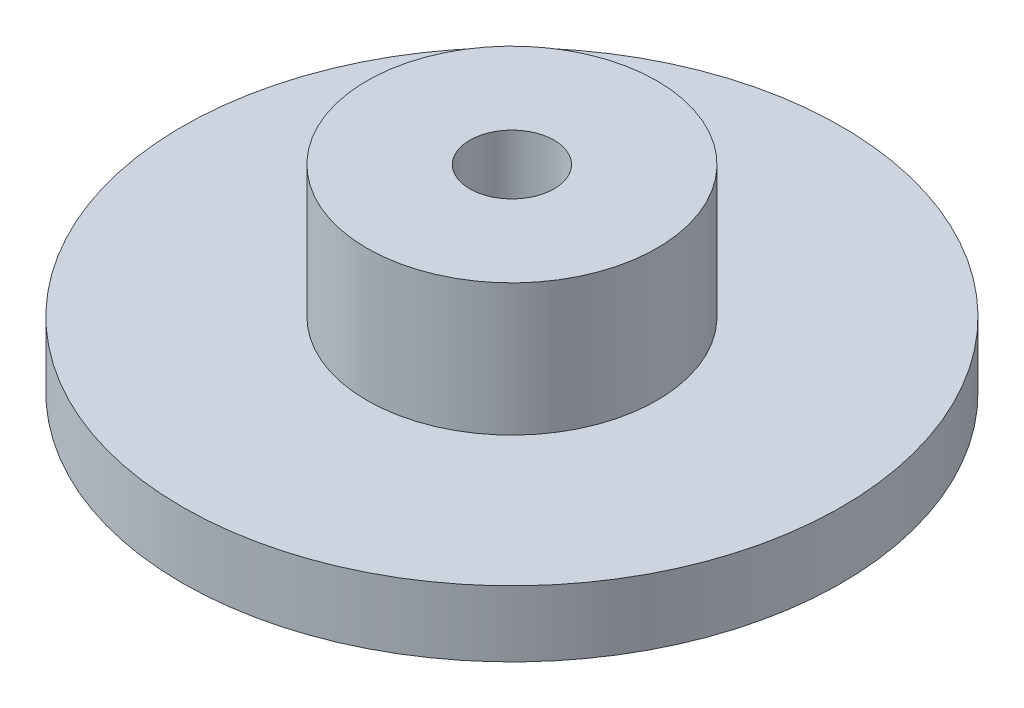
ISO-10303-21;
HEADER;
FILE_DESCRIPTION(('STEP AP214'),'2;1');
FILE_NAME('part.step','',(''),(''),'','','');
FILE_SCHEMA(('AUTOMOTIVE_DESIGN { 1 0 10303 214 1 1 1 1 }'));
ENDSEC;
DATA;
#1=APPLICATION_CONTEXT('core data for automotive mechanical design processes');
#2=APPLICATION_PROTOCOL_DEFINITION('international standard','automotive_design',2000,#1);
#3=PRODUCT_CONTEXT('',#1,'mechanical');
#4=PRODUCT('Part','Part','',(#3));
#5=PRODUCT_RELATED_PRODUCT_CATEGORY('part','',(#4));
#6=PRODUCT_DEFINITION_FORMATION('','',#4);
#7=PRODUCT_DEFINITION_CONTEXT('part definition',#1,'design');
#8=PRODUCT_DEFINITION('design','',#6,#7);
#9=PRODUCT_DEFINITION_SHAPE('','',#8);
#10=(LENGTH_UNIT() NAMED_UNIT(*) SI_UNIT(.MILLI.,.METRE.));
#11=(NAMED_UNIT(*) PLANE_ANGLE_UNIT() SI_UNIT($,.RADIAN.));
#12=(NAMED_UNIT(*) SI_UNIT($,.STERADIAN.) SOLID_ANGLE_UNIT());
#13=UNCERTAINTY_MEASURE_WITH_UNIT(LENGTH_MEASURE(1.E-05),#10,'distance_accuracy_value','');
#14=(GEOMETRIC_REPRESENTATION_CONTEXT(3) GLOBAL_UNCERTAINTY_ASSIGNED_CONTEXT((#13)) GLOBAL_UNIT_ASSIGNED_CONTEXT((#10,
#11,#12)) REPRESENTATION_CONTEXT('',''));
#15=CARTESIAN_POINT('',(0.,0.,0.));
#16=DIRECTION('',(0.,0.,1.));
#17=DIRECTION('',(1.,0.,0.));
#18=AXIS2_PLACEMENT_3D('',#15,#16,#17);
#19=CARTESIAN_POINT('',(0.,2.5,0.));
#20=DIRECTION('',(0.,-1.,0.));
#21=DIRECTION('',(0.,0.,-1.));
#22=AXIS2_PLACEMENT_3D('',#19,#20,#21);
#23=CYLINDRICAL_SURFACE('',#22,12.5);
#24=CARTESIAN_POINT('',(0.,2.5,0.));
#25=DIRECTION('',(0.,1.,0.));
#26=DIRECTION('',(0.,0.,1.));
#27=AXIS2_PLACEMENT_3D('',#24,#25,#26);
#28=CIRCLE('',#27,12.5);
#29=CARTESIAN_POINT('',(0.,2.5,12.5));
#30=VERTEX_POINT('',#29);
#31=EDGE_CURVE('E37',#30,#30,#28,.T.);
#32=ORIENTED_EDGE('',*,*,#31,.F.);
#33=EDGE_LOOP('',(#32));
#34=FACE_BOUND('',#33,.T.);
#35=CARTESIAN_POINT('',(0.,0.,0.));
#36=DIRECTION('',(0.,1.,0.));
#37=DIRECTION('',(0.,0.,1.));
#38=AXIS2_PLACEMENT_3D('',#35,#36,#37);
#39=CIRCLE('',#38,12.5);
#40=CARTESIAN_POINT('',(0.,0.,12.5));
#41=VERTEX_POINT('',#40);
#42=EDGE_CURVE('E42',#41,#41,#39,.T.);
#43=ORIENTED_EDGE('',*,*,#42,.T.);
#44=EDGE_LOOP('',(#43));
#45=FACE_BOUND('',#44,.T.);
#46=ADVANCED_FACE('F30',(#34,#45),#23,.T.);
#47=CARTESIAN_POINT('',(0.,2.5,0.));
#48=DIRECTION('',(0.,1.,0.));
#49=DIRECTION('',(0.,0.,1.));
#50=AXIS2_PLACEMENT_3D('',#47,#48,#49);
#51=PLANE('',#50);
#52=CARTESIAN_POINT('',(0.,2.5,0.));
#53=DIRECTION('',(0.,1.,0.));
#54=DIRECTION('',(0.,0.,1.));
#55=AXIS2_PLACEMENT_3D('',#52,#53,#54);
#56=CIRCLE('',#55,5.5);
#57=CARTESIAN_POINT('',(0.,2.5,5.5));
#58=VERTEX_POINT('',#57);
#59=EDGE_CURVE('E10',#58,#58,#56,.T.);
#60=ORIENTED_EDGE('',*,*,#59,.F.);
#61=EDGE_LOOP('',(#60));
#62=FACE_BOUND('',#61,.T.);
#63=ORIENTED_EDGE('',*,*,#31,.T.);
#64=EDGE_LOOP('',(#63));
#65=FACE_BOUND('',#64,.T.);
#66=ADVANCED_FACE('F74',(#62,#65),#51,.T.);
#67=CARTESIAN_POINT('',(0.,0.,0.));
#68=DIRECTION('',(0.,1.,0.));
#69=DIRECTION('',(0.,0.,1.));
#70=AXIS2_PLACEMENT_3D('',#67,#68,#69);
#71=PLANE('',#70);
#72=CARTESIAN_POINT('',(0.,0.,0.));
#73=DIRECTION('',(0.,-1.,0.));
#74=DIRECTION('',(0.,0.,-1.));
#75=AXIS2_PLACEMENT_3D('',#72,#73,#74);
#76=CIRCLE('',#75,4.00000000000001);
#77=CARTESIAN_POINT('',(0.,0.,-4.00000000000001));
#78=VERTEX_POINT('',#77);
#79=EDGE_CURVE('E62',#78,#78,#76,.T.);
#80=ORIENTED_EDGE('',*,*,#79,.F.);
#81=EDGE_LOOP('',(#80));
#82=FACE_BOUND('',#81,.T.);
#83=ORIENTED_EDGE('',*,*,#42,.F.);
#84=EDGE_LOOP('',(#83));
#85=FACE_BOUND('',#84,.T.);
#86=ADVANCED_FACE('F70',(#82,#85),#71,.F.);
#87=CARTESIAN_POINT('',(0.,7.5,0.));
#88=DIRECTION('',(0.,-1.,0.));
#89=DIRECTION('',(0.,0.,-1.));
#90=AXIS2_PLACEMENT_3D('',#87,#88,#89);
#91=CYLINDRICAL_SURFACE('',#90,5.5);
#92=CARTESIAN_POINT('',(0.,7.5,0.));
#93=DIRECTION('',(0.,1.,0.));
#94=DIRECTION('',(0.,0.,1.));
#95=AXIS2_PLACEMENT_3D('',#92,#93,#94);
#96=CIRCLE('',#95,5.5);
#97=CARTESIAN_POINT('',(0.,7.5,5.5));
#98=VERTEX_POINT('',#97);
#99=EDGE_CURVE('E45',#98,#98,#96,.T.);
#100=ORIENTED_EDGE('',*,*,#99,.F.);
#101=EDGE_LOOP('',(#100));
#102=FACE_BOUND('',#101,.T.);
#103=ORIENTED_EDGE('',*,*,#59,.T.);
#104=EDGE_LOOP('',(#103));
#105=FACE_BOUND('',#104,.T.);
#106=ADVANCED_FACE('F73',(#102,#105),#91,.T.);
#107=CARTESIAN_POINT('',(0.,7.5,0.));
#108=DIRECTION('',(0.,1.,0.));
#109=DIRECTION('',(0.,0.,1.));
#110=AXIS2_PLACEMENT_3D('',#107,#108,#109);
#111=PLANE('',#110);
#112=CARTESIAN_POINT('',(0.,7.5,0.));
#113=DIRECTION('',(0.,1.,0.));
#114=DIRECTION('',(0.,0.,1.));
#115=AXIS2_PLACEMENT_3D('',#112,#113,#114);
#116=CIRCLE('',#115,1.60000000000001);
#117=CARTESIAN_POINT('',(0.,7.5,1.60000000000001));
#118=VERTEX_POINT('',#117);
#119=EDGE_CURVE('E33',#118,#118,#116,.T.);
#120=ORIENTED_EDGE('',*,*,#119,.F.);
#121=EDGE_LOOP('',(#120));
#122=FACE_BOUND('',#121,.T.);
#123=ORIENTED_EDGE('',*,*,#99,.T.);
#124=EDGE_LOOP('',(#123));
#125=FACE_BOUND('',#124,.T.);
#126=ADVANCED_FACE('F79',(#122,#125),#111,.T.);
#127=CARTESIAN_POINT('',(0.,0.,0.));
#128=DIRECTION('',(0.,-1.,0.));
#129=DIRECTION('',(0.,0.,-1.));
#130=AXIS2_PLACEMENT_3D('',#127,#128,#129);
#131=CYLINDRICAL_SURFACE('',#130,1.60000000000001);
#132=ORIENTED_EDGE('',*,*,#119,.T.);
#133=EDGE_LOOP('',(#132));
#134=FACE_BOUND('',#133,.T.);
#135=CARTESIAN_POINT('',(0.,3.,0.));
#136=DIRECTION('',(0.,-1.,0.));
#137=DIRECTION('',(0.,0.,-1.));
#138=AXIS2_PLACEMENT_3D('',#135,#136,#137);
#139=CIRCLE('',#138,1.60000000000001);
#140=CARTESIAN_POINT('',(0.,3.,-1.60000000000001));
#141=VERTEX_POINT('',#140);
#142=EDGE_CURVE('E54',#141,#141,#139,.T.);
#143=ORIENTED_EDGE('',*,*,#142,.T.);
#144=EDGE_LOOP('',(#143));
#145=FACE_BOUND('',#144,.T.);
#146=ADVANCED_FACE('F113',(#134,#145),#131,.F.);
#147=CARTESIAN_POINT('',(1.60000000000001,3.,0.));
#148=DIRECTION('',(0.,1.,0.));
#149=DIRECTION('',(0.,0.,1.));
#150=AXIS2_PLACEMENT_3D('',#147,#148,#149);
#151=PLANE('',#150);
#152=ORIENTED_EDGE('',*,*,#142,.F.);
#153=EDGE_LOOP('',(#152));
#154=FACE_BOUND('',#153,.T.);
#155=CARTESIAN_POINT('',(0.,3.,0.));
#156=DIRECTION('',(0.,-1.,0.));
#157=DIRECTION('',(0.,0.,-1.));
#158=AXIS2_PLACEMENT_3D('',#155,#156,#157);
#159=CIRCLE('',#158,4.00000000000001);
#160=CARTESIAN_POINT('',(0.,3.,-4.00000000000001));
#161=VERTEX_POINT('',#160);
#162=EDGE_CURVE('E58',#161,#161,#159,.T.);
#163=ORIENTED_EDGE('',*,*,#162,.T.);
#164=EDGE_LOOP('',(#163));
#165=FACE_BOUND('',#164,.T.);
#166=ADVANCED_FACE('F123',(#154,#165),#151,.F.);
#167=CARTESIAN_POINT('',(0.,0.,0.));
#168=DIRECTION('',(0.,-1.,0.));
#169=DIRECTION('',(0.,0.,-1.));
#170=AXIS2_PLACEMENT_3D('',#167,#168,#169);
#171=CYLINDRICAL_SURFACE('',#170,4.00000000000001);
#172=ORIENTED_EDGE('',*,*,#162,.F.);
#173=EDGE_LOOP('',(#172));
#174=FACE_BOUND('',#173,.T.);
#175=ORIENTED_EDGE('',*,*,#79,.T.);
#176=EDGE_LOOP('',(#175));
#177=FACE_BOUND('',#176,.T.);
#178=ADVANCED_FACE('F68',(#174,#177),#171,.F.);
#179=CLOSED_SHELL('',(#46,#66,#86,#106,#126,#146,#166,#178));
#180=MANIFOLD_SOLID_BREP('B2',#179);
#181=ADVANCED_BREP_SHAPE_REPRESENTATION('',(#18,#180),#14);
#182=SHAPE_DEFINITION_REPRESENTATION(#9,#181);
ENDSEC;
END-ISO-10303-21;
